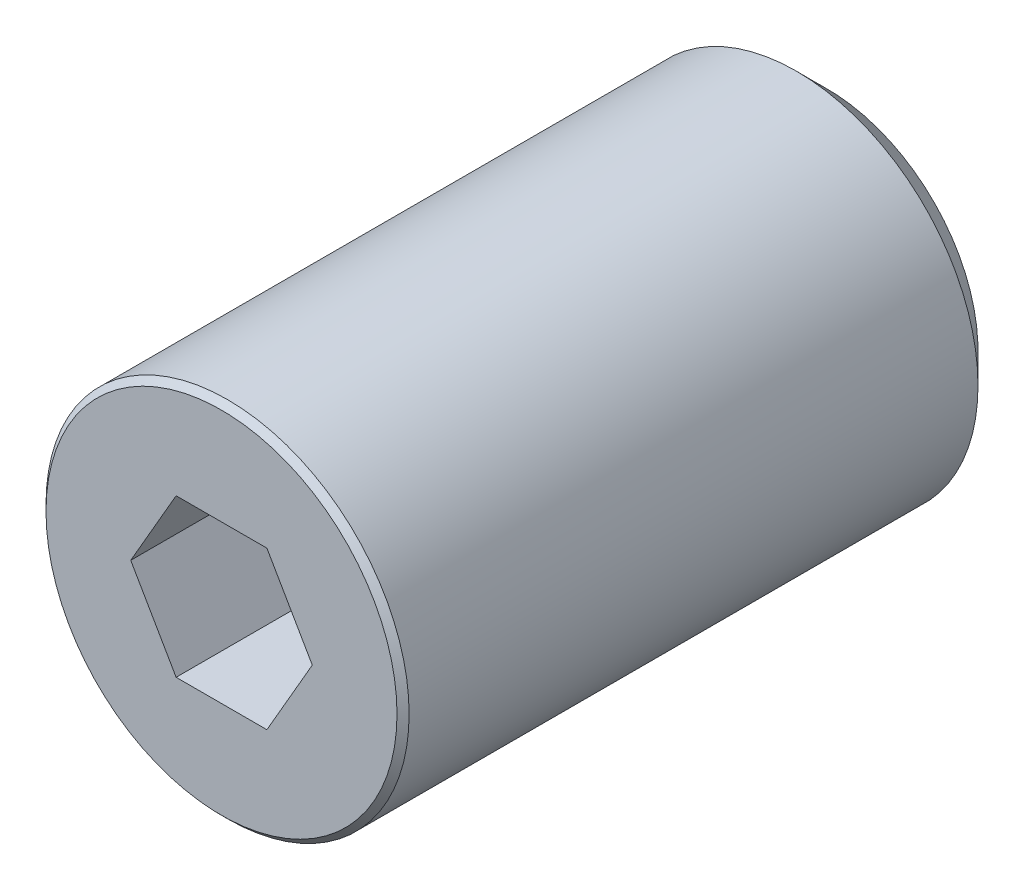
ISO-10303-21;
HEADER;
FILE_DESCRIPTION(('STEP AP214'),'2;1');
FILE_NAME('part.step','',(''),(''),'','','');
FILE_SCHEMA(('AUTOMOTIVE_DESIGN { 1 0 10303 214 1 1 1 1 }'));
ENDSEC;
DATA;
#1=APPLICATION_CONTEXT('core data for automotive mechanical design processes');
#2=APPLICATION_PROTOCOL_DEFINITION('international standard','automotive_design',2000,#1);
#3=PRODUCT_CONTEXT('',#1,'mechanical');
#4=PRODUCT('Part','Part','',(#3));
#5=PRODUCT_RELATED_PRODUCT_CATEGORY('part','',(#4));
#6=PRODUCT_DEFINITION_FORMATION('','',#4);
#7=PRODUCT_DEFINITION_CONTEXT('part definition',#1,'design');
#8=PRODUCT_DEFINITION('design','',#6,#7);
#9=PRODUCT_DEFINITION_SHAPE('','',#8);
#10=(LENGTH_UNIT() NAMED_UNIT(*) SI_UNIT(.MILLI.,.METRE.));
#11=(NAMED_UNIT(*) PLANE_ANGLE_UNIT() SI_UNIT($,.RADIAN.));
#12=(NAMED_UNIT(*) SI_UNIT($,.STERADIAN.) SOLID_ANGLE_UNIT());
#13=UNCERTAINTY_MEASURE_WITH_UNIT(LENGTH_MEASURE(1.E-05),#10,'distance_accuracy_value','');
#14=(GEOMETRIC_REPRESENTATION_CONTEXT(3) GLOBAL_UNCERTAINTY_ASSIGNED_CONTEXT((#13)) GLOBAL_UNIT_ASSIGNED_CONTEXT((#10,
#11,#12)) REPRESENTATION_CONTEXT('',''));
#15=CARTESIAN_POINT('',(0.,0.,0.));
#16=DIRECTION('',(0.,0.,1.));
#17=DIRECTION('',(1.,0.,0.));
#18=AXIS2_PLACEMENT_3D('',#15,#16,#17);
#19=CARTESIAN_POINT('',(0.,0.,0.));
#20=DIRECTION('',(0.,0.,1.));
#21=DIRECTION('',(1.,0.,0.));
#22=AXIS2_PLACEMENT_3D('',#19,#20,#21);
#23=CYLINDRICAL_SURFACE('',#22,3.);
#24=CARTESIAN_POINT('',(0.,0.,0.500000243269582));
#25=DIRECTION('',(0.,0.,-1.));
#26=DIRECTION('',(-1.,0.,0.));
#27=AXIS2_PLACEMENT_3D('',#24,#25,#26);
#28=CIRCLE('',#27,3.);
#29=CARTESIAN_POINT('',(-3.,0.,0.500000243269582));
#30=VERTEX_POINT('',#29);
#31=EDGE_CURVE('E48',#30,#30,#28,.F.);
#32=ORIENTED_EDGE('',*,*,#31,.T.);
#33=EDGE_LOOP('',(#32));
#34=FACE_BOUND('',#33,.T.);
#35=CARTESIAN_POINT('',(0.,0.,9.89999992487731));
#36=DIRECTION('',(0.,0.,1.));
#37=DIRECTION('',(1.,0.,0.));
#38=AXIS2_PLACEMENT_3D('',#35,#36,#37);
#39=CIRCLE('',#38,3.);
#40=CARTESIAN_POINT('',(3.,0.,9.89999992487731));
#41=VERTEX_POINT('',#40);
#42=EDGE_CURVE('E265',#41,#41,#39,.F.);
#43=ORIENTED_EDGE('',*,*,#42,.T.);
#44=EDGE_LOOP('',(#43));
#45=FACE_BOUND('',#44,.T.);
#46=ADVANCED_FACE('F39',(#34,#45),#23,.T.);
#47=CARTESIAN_POINT('',(3.,0.,0.));
#48=DIRECTION('',(0.,0.,-1.));
#49=DIRECTION('',(-1.,0.,0.));
#50=AXIS2_PLACEMENT_3D('',#47,#48,#49);
#51=PLANE('',#50);
#52=CARTESIAN_POINT('',(0.,0.,0.));
#53=DIRECTION('',(0.,0.,-1.));
#54=DIRECTION('',(-1.,0.,0.));
#55=AXIS2_PLACEMENT_3D('',#52,#53,#54);
#56=CIRCLE('',#55,2.4999996747622);
#57=CARTESIAN_POINT('',(-2.4999996747622,0.,0.));
#58=VERTEX_POINT('',#57);
#59=EDGE_CURVE('E11',#58,#58,#56,.T.);
#60=ORIENTED_EDGE('',*,*,#59,.T.);
#61=EDGE_LOOP('',(#60));
#62=FACE_BOUND('',#61,.T.);
#63=CARTESIAN_POINT('',(0.,0.,0.));
#64=DIRECTION('',(0.,0.,1.));
#65=DIRECTION('',(1.,0.,0.));
#66=AXIS2_PLACEMENT_3D('',#63,#64,#65);
#67=CIRCLE('',#66,1.49999899991826);
#68=CARTESIAN_POINT('',(1.49999899991826,0.,0.));
#69=VERTEX_POINT('',#68);
#70=EDGE_CURVE('E220',#69,#69,#67,.T.);
#71=ORIENTED_EDGE('',*,*,#70,.T.);
#72=EDGE_LOOP('',(#71));
#73=FACE_BOUND('',#72,.T.);
#74=ADVANCED_FACE('F131',(#62,#73),#51,.T.);
#75=CARTESIAN_POINT('',(0.,0.,10.));
#76=DIRECTION('',(0.,0.,1.));
#77=DIRECTION('',(1.,0.,0.));
#78=AXIS2_PLACEMENT_3D('',#75,#76,#77);
#79=PLANE('',#78);
#80=CARTESIAN_POINT('',(0.,0.,10.));
#81=DIRECTION('',(0.,0.,1.));
#82=DIRECTION('',(1.,0.,0.));
#83=AXIS2_PLACEMENT_3D('',#80,#81,#82);
#84=CIRCLE('',#83,2.89999987934581);
#85=CARTESIAN_POINT('',(2.89999987934581,0.,10.));
#86=VERTEX_POINT('',#85);
#87=EDGE_CURVE('E253',#86,#86,#84,.T.);
#88=ORIENTED_EDGE('',*,*,#87,.T.);
#89=EDGE_LOOP('',(#88));
#90=FACE_BOUND('',#89,.T.);
#91=DIRECTION('',(1.,0.,0.));
#92=VECTOR('',#91,1.);
#93=CARTESIAN_POINT('',(-0.749999999999874,-1.29903810567693,10.));
#94=LINE('',#93,#92);
#95=CARTESIAN_POINT('',(-0.749999999999874,-1.29903810567693,10.));
#96=VERTEX_POINT('',#95);
#97=CARTESIAN_POINT('',(0.750000000000083,-1.29903810567693,10.));
#98=VERTEX_POINT('',#97);
#99=EDGE_CURVE('E230',#96,#98,#94,.T.);
#100=ORIENTED_EDGE('',*,*,#99,.F.);
#101=DIRECTION('',(0.5,-0.866025403784439,0.));
#102=VECTOR('',#101,1.);
#103=CARTESIAN_POINT('',(-1.50000000000004,0.,10.));
#104=LINE('',#103,#102);
#105=CARTESIAN_POINT('',(-1.50000000000004,0.,10.));
#106=VERTEX_POINT('',#105);
#107=EDGE_CURVE('E247',#106,#96,#104,.T.);
#108=ORIENTED_EDGE('',*,*,#107,.F.);
#109=DIRECTION('',(-0.5,-0.866025403784439,0.));
#110=VECTOR('',#109,1.);
#111=CARTESIAN_POINT('',(-0.749999999999895,1.29903810567694,10.));
#112=LINE('',#111,#110);
#113=CARTESIAN_POINT('',(-0.749999999999895,1.29903810567694,10.));
#114=VERTEX_POINT('',#113);
#115=EDGE_CURVE('E244',#114,#106,#112,.T.);
#116=ORIENTED_EDGE('',*,*,#115,.F.);
#117=DIRECTION('',(-1.,0.,0.));
#118=VECTOR('',#117,1.);
#119=CARTESIAN_POINT('',(0.750000000000062,1.29903810567694,10.));
#120=LINE('',#119,#118);
#121=CARTESIAN_POINT('',(0.750000000000062,1.29903810567694,10.));
#122=VERTEX_POINT('',#121);
#123=EDGE_CURVE('E241',#122,#114,#120,.T.);
#124=ORIENTED_EDGE('',*,*,#123,.F.);
#125=DIRECTION('',(-0.5,0.866025403784439,0.));
#126=VECTOR('',#125,1.);
#127=CARTESIAN_POINT('',(1.50000000000023,0.,10.));
#128=LINE('',#127,#126);
#129=CARTESIAN_POINT('',(1.50000000000023,0.,10.));
#130=VERTEX_POINT('',#129);
#131=EDGE_CURVE('E238',#130,#122,#128,.T.);
#132=ORIENTED_EDGE('',*,*,#131,.F.);
#133=DIRECTION('',(0.5,0.866025403784439,0.));
#134=VECTOR('',#133,1.);
#135=CARTESIAN_POINT('',(0.750000000000083,-1.29903810567693,10.));
#136=LINE('',#135,#134);
#137=EDGE_CURVE('E233',#98,#130,#136,.T.);
#138=ORIENTED_EDGE('',*,*,#137,.F.);
#139=EDGE_LOOP('',(#100,#108,#116,#124,#132,#138));
#140=FACE_BOUND('',#139,.T.);
#141=ADVANCED_FACE('F137',(#90,#140),#79,.T.);
#142=CARTESIAN_POINT('',(-0.749999999999874,-1.29903810567693,7.));
#143=DIRECTION('',(0.,-1.,0.));
#144=DIRECTION('',(0.,0.,-1.));
#145=AXIS2_PLACEMENT_3D('',#142,#143,#144);
#146=PLANE('',#145);
#147=DIRECTION('',(0.,0.,1.));
#148=VECTOR('',#147,1.);
#149=CARTESIAN_POINT('',(0.750000000000083,-1.29903810567693,7.));
#150=LINE('',#149,#148);
#151=CARTESIAN_POINT('',(0.750000000000083,-1.29903810567693,8.00000000000002));
#152=VERTEX_POINT('',#151);
#153=EDGE_CURVE('E250',#152,#98,#150,.T.);
#154=ORIENTED_EDGE('',*,*,#153,.F.);
#155=DIRECTION('',(-1.,0.,0.));
#156=VECTOR('',#155,1.);
#157=CARTESIAN_POINT('',(-0.749999999999874,-1.29903810567693,8.00000000000002));
#158=LINE('',#157,#156);
#159=CARTESIAN_POINT('',(-0.749999999999874,-1.29903810567693,8.00000000000002));
#160=VERTEX_POINT('',#159);
#161=EDGE_CURVE('E209',#152,#160,#158,.T.);
#162=ORIENTED_EDGE('',*,*,#161,.T.);
#163=DIRECTION('',(0.,0.,1.));
#164=VECTOR('',#163,1.);
#165=CARTESIAN_POINT('',(-0.749999999999874,-1.29903810567693,7.));
#166=LINE('',#165,#164);
#167=EDGE_CURVE('E251',#160,#96,#166,.T.);
#168=ORIENTED_EDGE('',*,*,#167,.T.);
#169=ORIENTED_EDGE('',*,*,#99,.T.);
#170=EDGE_LOOP('',(#154,#162,#168,#169));
#171=FACE_BOUND('',#170,.T.);
#172=ADVANCED_FACE('F286',(#171),#146,.F.);
#173=CARTESIAN_POINT('',(-1.50000000000004,0.,7.));
#174=DIRECTION('',(-0.866025403784439,-0.5,0.));
#175=DIRECTION('',(0.5,-0.866025403784439,0.));
#176=AXIS2_PLACEMENT_3D('',#173,#174,#175);
#177=PLANE('',#176);
#178=ORIENTED_EDGE('',*,*,#167,.F.);
#179=DIRECTION('',(-0.5,0.866025403784439,0.));
#180=VECTOR('',#179,1.);
#181=CARTESIAN_POINT('',(-1.50000000000004,0.,8.00000000000002));
#182=LINE('',#181,#180);
#183=CARTESIAN_POINT('',(-1.50000000000004,0.,8.00000000000002));
#184=VERTEX_POINT('',#183);
#185=EDGE_CURVE('E280',#160,#184,#182,.T.);
#186=ORIENTED_EDGE('',*,*,#185,.T.);
#187=DIRECTION('',(0.,0.,1.));
#188=VECTOR('',#187,1.);
#189=CARTESIAN_POINT('',(-1.50000000000004,0.,7.));
#190=LINE('',#189,#188);
#191=EDGE_CURVE('E254',#184,#106,#190,.T.);
#192=ORIENTED_EDGE('',*,*,#191,.T.);
#193=ORIENTED_EDGE('',*,*,#107,.T.);
#194=EDGE_LOOP('',(#178,#186,#192,#193));
#195=FACE_BOUND('',#194,.T.);
#196=ADVANCED_FACE('F290',(#195),#177,.F.);
#197=CARTESIAN_POINT('',(-0.749999999999895,1.29903810567694,7.));
#198=DIRECTION('',(-0.866025403784439,0.5,0.));
#199=DIRECTION('',(-0.5,-0.866025403784439,0.));
#200=AXIS2_PLACEMENT_3D('',#197,#198,#199);
#201=PLANE('',#200);
#202=ORIENTED_EDGE('',*,*,#191,.F.);
#203=DIRECTION('',(0.5,0.866025403784439,0.));
#204=VECTOR('',#203,1.);
#205=CARTESIAN_POINT('',(-0.749999999999895,1.29903810567694,8.00000000000002));
#206=LINE('',#205,#204);
#207=CARTESIAN_POINT('',(-0.749999999999895,1.29903810567694,8.00000000000002));
#208=VERTEX_POINT('',#207);
#209=EDGE_CURVE('E283',#184,#208,#206,.T.);
#210=ORIENTED_EDGE('',*,*,#209,.T.);
#211=DIRECTION('',(0.,0.,1.));
#212=VECTOR('',#211,1.);
#213=CARTESIAN_POINT('',(-0.749999999999895,1.29903810567694,7.));
#214=LINE('',#213,#212);
#215=EDGE_CURVE('E256',#208,#114,#214,.T.);
#216=ORIENTED_EDGE('',*,*,#215,.T.);
#217=ORIENTED_EDGE('',*,*,#115,.T.);
#218=EDGE_LOOP('',(#202,#210,#216,#217));
#219=FACE_BOUND('',#218,.T.);
#220=ADVANCED_FACE('F302',(#219),#201,.F.);
#221=CARTESIAN_POINT('',(0.750000000000062,1.29903810567694,7.));
#222=DIRECTION('',(0.,1.,0.));
#223=DIRECTION('',(0.,0.,1.));
#224=AXIS2_PLACEMENT_3D('',#221,#222,#223);
#225=PLANE('',#224);
#226=ORIENTED_EDGE('',*,*,#215,.F.);
#227=DIRECTION('',(1.,0.,0.));
#228=VECTOR('',#227,1.);
#229=CARTESIAN_POINT('',(0.750000000000062,1.29903810567694,8.00000000000002));
#230=LINE('',#229,#228);
#231=CARTESIAN_POINT('',(0.750000000000062,1.29903810567694,8.00000000000002));
#232=VERTEX_POINT('',#231);
#233=EDGE_CURVE('E63',#208,#232,#230,.T.);
#234=ORIENTED_EDGE('',*,*,#233,.T.);
#235=DIRECTION('',(0.,0.,1.));
#236=VECTOR('',#235,1.);
#237=CARTESIAN_POINT('',(0.750000000000062,1.29903810567694,7.));
#238=LINE('',#237,#236);
#239=EDGE_CURVE('E258',#232,#122,#238,.T.);
#240=ORIENTED_EDGE('',*,*,#239,.T.);
#241=ORIENTED_EDGE('',*,*,#123,.T.);
#242=EDGE_LOOP('',(#226,#234,#240,#241));
#243=FACE_BOUND('',#242,.T.);
#244=ADVANCED_FACE('F303',(#243),#225,.F.);
#245=CARTESIAN_POINT('',(1.50000000000023,0.,7.));
#246=DIRECTION('',(0.866025403784439,0.5,0.));
#247=DIRECTION('',(-0.5,0.866025403784439,0.));
#248=AXIS2_PLACEMENT_3D('',#245,#246,#247);
#249=PLANE('',#248);
#250=ORIENTED_EDGE('',*,*,#239,.F.);
#251=DIRECTION('',(0.5,-0.866025403784439,0.));
#252=VECTOR('',#251,1.);
#253=CARTESIAN_POINT('',(1.50000000000023,0.,8.00000000000002));
#254=LINE('',#253,#252);
#255=CARTESIAN_POINT('',(1.50000000000023,0.,8.00000000000002));
#256=VERTEX_POINT('',#255);
#257=EDGE_CURVE('E55',#232,#256,#254,.T.);
#258=ORIENTED_EDGE('',*,*,#257,.T.);
#259=DIRECTION('',(0.,0.,1.));
#260=VECTOR('',#259,1.);
#261=CARTESIAN_POINT('',(1.50000000000023,0.,7.));
#262=LINE('',#261,#260);
#263=EDGE_CURVE('E260',#256,#130,#262,.T.);
#264=ORIENTED_EDGE('',*,*,#263,.T.);
#265=ORIENTED_EDGE('',*,*,#131,.T.);
#266=EDGE_LOOP('',(#250,#258,#264,#265));
#267=FACE_BOUND('',#266,.T.);
#268=ADVANCED_FACE('F309',(#267),#249,.F.);
#269=CARTESIAN_POINT('',(0.750000000000083,-1.29903810567693,7.));
#270=DIRECTION('',(0.866025403784439,-0.5,0.));
#271=DIRECTION('',(0.5,0.866025403784439,0.));
#272=AXIS2_PLACEMENT_3D('',#269,#270,#271);
#273=PLANE('',#272);
#274=ORIENTED_EDGE('',*,*,#263,.F.);
#275=DIRECTION('',(-0.5,-0.866025403784439,0.));
#276=VECTOR('',#275,1.);
#277=CARTESIAN_POINT('',(0.750000000000083,-1.29903810567693,8.00000000000002));
#278=LINE('',#277,#276);
#279=EDGE_CURVE('E201',#256,#152,#278,.T.);
#280=ORIENTED_EDGE('',*,*,#279,.T.);
#281=ORIENTED_EDGE('',*,*,#153,.T.);
#282=ORIENTED_EDGE('',*,*,#137,.T.);
#283=EDGE_LOOP('',(#274,#280,#281,#282));
#284=FACE_BOUND('',#283,.T.);
#285=ADVANCED_FACE('F126',(#284),#273,.F.);
#286=CARTESIAN_POINT('',(0.,0.,7.));
#287=DIRECTION('',(0.,0.,1.));
#288=DIRECTION('',(1.,0.,0.));
#289=AXIS2_PLACEMENT_3D('',#286,#287,#288);
#290=PLANE('',#289);
#291=DIRECTION('',(-0.5,-0.866025403784439,0.));
#292=VECTOR('',#291,1.);
#293=CARTESIAN_POINT('',(-0.150000000000072,0.0866025403784857,7.));
#294=LINE('',#293,#292);
#295=CARTESIAN_POINT('',(-0.0999999999999144,0.173205080757203,7.));
#296=VERTEX_POINT('',#295);
#297=CARTESIAN_POINT('',(-0.200000000000082,0.,7.));
#298=VERTEX_POINT('',#297);
#299=EDGE_CURVE('E275',#296,#298,#294,.T.);
#300=ORIENTED_EDGE('',*,*,#299,.T.);
#301=DIRECTION('',(0.5,-0.866025403784439,0.));
#302=VECTOR('',#301,1.);
#303=CARTESIAN_POINT('',(-0.150000000000051,-0.0866025403784735,7.));
#304=LINE('',#303,#302);
#305=CARTESIAN_POINT('',(-0.0999999999998934,-0.173205080757191,7.));
#306=VERTEX_POINT('',#305);
#307=EDGE_CURVE('E277',#298,#306,#304,.T.);
#308=ORIENTED_EDGE('',*,*,#307,.T.);
#309=DIRECTION('',(1.,0.,0.));
#310=VECTOR('',#309,1.);
#311=CARTESIAN_POINT('',(0.,-0.173205080757191,7.));
#312=LINE('',#311,#310);
#313=CARTESIAN_POINT('',(0.100000000000102,-0.173205080757191,7.));
#314=VERTEX_POINT('',#313);
#315=EDGE_CURVE('E273',#306,#314,#312,.T.);
#316=ORIENTED_EDGE('',*,*,#315,.T.);
#317=DIRECTION('',(0.5,0.866025403784439,0.));
#318=VECTOR('',#317,1.);
#319=CARTESIAN_POINT('',(0.150000000000208,-0.0866025403785638,7.));
#320=LINE('',#319,#318);
#321=CARTESIAN_POINT('',(0.20000000000027,0.,7.));
#322=VERTEX_POINT('',#321);
#323=EDGE_CURVE('E269',#314,#322,#320,.T.);
#324=ORIENTED_EDGE('',*,*,#323,.T.);
#325=DIRECTION('',(-0.5,0.866025403784439,0.));
#326=VECTOR('',#325,1.);
#327=CARTESIAN_POINT('',(0.150000000000197,0.0866025403785578,7.));
#328=LINE('',#327,#326);
#329=CARTESIAN_POINT('',(0.100000000000081,0.173205080757203,7.));
#330=VERTEX_POINT('',#329);
#331=EDGE_CURVE('E195',#322,#330,#328,.T.);
#332=ORIENTED_EDGE('',*,*,#331,.T.);
#333=DIRECTION('',(-1.,0.,0.));
#334=VECTOR('',#333,1.);
#335=CARTESIAN_POINT('',(0.,0.173205080757203,7.));
#336=LINE('',#335,#334);
#337=EDGE_CURVE('E271',#330,#296,#336,.T.);
#338=ORIENTED_EDGE('',*,*,#337,.T.);
#339=EDGE_LOOP('',(#300,#308,#316,#324,#332,#338));
#340=FACE_BOUND('',#339,.T.);
#341=ADVANCED_FACE('F116',(#340),#290,.T.);
#342=CARTESIAN_POINT('',(0.,0.,0.500000311660642));
#343=DIRECTION('',(0.,0.,-1.));
#344=DIRECTION('',(-1.,0.,0.));
#345=AXIS2_PLACEMENT_3D('',#342,#343,#344);
#346=CONICAL_SURFACE('',#345,0.,1.24904538538531);
#347=ORIENTED_EDGE('',*,*,#70,.F.);
#348=EDGE_LOOP('',(#347));
#349=FACE_BOUND('',#348,.T.);
#350=CARTESIAN_POINT('',(0.,0.,0.500000311660642));
#351=VERTEX_POINT('',#350);
#352=VERTEX_LOOP('',#351);
#353=FACE_BOUND('',#352,.T.);
#354=ADVANCED_FACE('F113',(#349,#353),#346,.F.);
#355=CARTESIAN_POINT('',(0.,0.,10.));
#356=DIRECTION('',(0.,0.,-1.));
#357=DIRECTION('',(-1.,0.,0.));
#358=AXIS2_PLACEMENT_3D('',#355,#356,#357);
#359=CONICAL_SURFACE('',#358,2.89999987934581,0.785398391054734);
#360=ORIENTED_EDGE('',*,*,#42,.F.);
#361=EDGE_LOOP('',(#360));
#362=FACE_BOUND('',#361,.T.);
#363=ORIENTED_EDGE('',*,*,#87,.F.);
#364=EDGE_LOOP('',(#363));
#365=FACE_BOUND('',#364,.T.);
#366=ADVANCED_FACE('F115',(#362,#365),#359,.T.);
#367=CARTESIAN_POINT('',(0.150000000000197,0.0866025403785578,7.));
#368=DIRECTION('',(0.575118031124382,0.332044550085469,-0.747653440461658));
#369=DIRECTION('',(-0.5,0.866025403784439,0.));
#370=AXIS2_PLACEMENT_3D('',#367,#368,#369);
#371=PLANE('',#370);
#372=DIRECTION('',(0.792623989104585,0.,0.609710760849712));
#373=VECTOR('',#372,1.);
#374=CARTESIAN_POINT('',(0.168587360595028,0.,6.97583643122674));
#375=LINE('',#374,#373);
#376=EDGE_CURVE('E191',#256,#322,#375,.F.);
#377=ORIENTED_EDGE('',*,*,#376,.F.);
#378=ORIENTED_EDGE('',*,*,#257,.F.);
#379=DIRECTION('',(-0.396311994552292,-0.686432510213531,-0.609710760849712));
#380=VECTOR('',#379,1.);
#381=CARTESIAN_POINT('',(0.0842936802974667,0.146000937032355,6.97583643122675));
#382=LINE('',#381,#380);
#383=EDGE_CURVE('E197',#330,#232,#382,.F.);
#384=ORIENTED_EDGE('',*,*,#383,.F.);
#385=ORIENTED_EDGE('',*,*,#331,.F.);
#386=EDGE_LOOP('',(#377,#378,#384,#385));
#387=FACE_BOUND('',#386,.T.);
#388=ADVANCED_FACE('F123',(#387),#371,.F.);
#389=CARTESIAN_POINT('',(0.,0.173205080757203,7.));
#390=DIRECTION('',(0.,0.664089100170938,-0.747653440461658));
#391=DIRECTION('',(-1.,0.,0.));
#392=AXIS2_PLACEMENT_3D('',#389,#390,#391);
#393=PLANE('',#392);
#394=ORIENTED_EDGE('',*,*,#383,.T.);
#395=ORIENTED_EDGE('',*,*,#233,.F.);
#396=DIRECTION('',(0.396311994552293,-0.686432510213531,-0.609710760849712));
#397=VECTOR('',#396,1.);
#398=CARTESIAN_POINT('',(-0.0842936802972632,0.146000937032291,6.97583643122669));
#399=LINE('',#398,#397);
#400=EDGE_CURVE('E198',#296,#208,#399,.F.);
#401=ORIENTED_EDGE('',*,*,#400,.F.);
#402=ORIENTED_EDGE('',*,*,#337,.F.);
#403=EDGE_LOOP('',(#394,#395,#401,#402));
#404=FACE_BOUND('',#403,.T.);
#405=ADVANCED_FACE('F176',(#404),#393,.F.);
#406=CARTESIAN_POINT('',(0.150000000000208,-0.0866025403785638,7.));
#407=DIRECTION('',(0.575118031124381,-0.332044550085469,-0.747653440461658));
#408=DIRECTION('',(0.5,0.866025403784439,0.));
#409=AXIS2_PLACEMENT_3D('',#406,#407,#408);
#410=PLANE('',#409);
#411=ORIENTED_EDGE('',*,*,#376,.T.);
#412=ORIENTED_EDGE('',*,*,#323,.F.);
#413=DIRECTION('',(0.396311994552293,-0.686432510213531,0.609710760849712));
#414=VECTOR('',#413,1.);
#415=CARTESIAN_POINT('',(0.0842936802974844,-0.146000937032337,6.97583643122674));
#416=LINE('',#415,#414);
#417=EDGE_CURVE('E203',#152,#314,#416,.F.);
#418=ORIENTED_EDGE('',*,*,#417,.F.);
#419=ORIENTED_EDGE('',*,*,#279,.F.);
#420=EDGE_LOOP('',(#411,#412,#418,#419));
#421=FACE_BOUND('',#420,.T.);
#422=ADVANCED_FACE('F169',(#421),#410,.F.);
#423=CARTESIAN_POINT('',(-0.150000000000072,0.0866025403784856,7.));
#424=DIRECTION('',(-0.575118031124381,0.332044550085469,-0.747653440461658));
#425=DIRECTION('',(-0.5,-0.866025403784439,0.));
#426=AXIS2_PLACEMENT_3D('',#423,#424,#425);
#427=PLANE('',#426);
#428=ORIENTED_EDGE('',*,*,#400,.T.);
#429=ORIENTED_EDGE('',*,*,#209,.F.);
#430=DIRECTION('',(0.792623989104585,0.,-0.609710760849712));
#431=VECTOR('',#430,1.);
#432=CARTESIAN_POINT('',(-0.168587360594859,0.,6.97583643122675));
#433=LINE('',#432,#431);
#434=EDGE_CURVE('E215',#298,#184,#433,.F.);
#435=ORIENTED_EDGE('',*,*,#434,.F.);
#436=ORIENTED_EDGE('',*,*,#299,.F.);
#437=EDGE_LOOP('',(#428,#429,#435,#436));
#438=FACE_BOUND('',#437,.T.);
#439=ADVANCED_FACE('F162',(#438),#427,.F.);
#440=CARTESIAN_POINT('',(0.,-0.173205080757191,7.));
#441=DIRECTION('',(0.,-0.664089100170938,-0.747653440461658));
#442=DIRECTION('',(1.,0.,0.));
#443=AXIS2_PLACEMENT_3D('',#440,#441,#442);
#444=PLANE('',#443);
#445=ORIENTED_EDGE('',*,*,#417,.T.);
#446=ORIENTED_EDGE('',*,*,#315,.F.);
#447=DIRECTION('',(-0.396311994552292,-0.686432510213531,0.609710760849712));
#448=VECTOR('',#447,1.);
#449=CARTESIAN_POINT('',(-0.0842936802972421,-0.146000937032279,6.97583643122669));
#450=LINE('',#449,#448);
#451=EDGE_CURVE('E213',#160,#306,#450,.F.);
#452=ORIENTED_EDGE('',*,*,#451,.F.);
#453=ORIENTED_EDGE('',*,*,#161,.F.);
#454=EDGE_LOOP('',(#445,#446,#452,#453));
#455=FACE_BOUND('',#454,.T.);
#456=ADVANCED_FACE('F155',(#455),#444,.F.);
#457=CARTESIAN_POINT('',(-0.150000000000051,-0.0866025403784734,7.));
#458=DIRECTION('',(-0.575118031124381,-0.332044550085469,-0.747653440461658));
#459=DIRECTION('',(0.5,-0.866025403784439,0.));
#460=AXIS2_PLACEMENT_3D('',#457,#458,#459);
#461=PLANE('',#460);
#462=ORIENTED_EDGE('',*,*,#434,.T.);
#463=ORIENTED_EDGE('',*,*,#185,.F.);
#464=ORIENTED_EDGE('',*,*,#451,.T.);
#465=ORIENTED_EDGE('',*,*,#307,.F.);
#466=EDGE_LOOP('',(#462,#463,#464,#465));
#467=FACE_BOUND('',#466,.T.);
#468=ADVANCED_FACE('F149',(#467),#461,.F.);
#469=CARTESIAN_POINT('',(0.,0.,0.500000243269582));
#470=DIRECTION('',(0.,0.,1.));
#471=DIRECTION('',(1.,0.,0.));
#472=AXIS2_PLACEMENT_3D('',#469,#470,#471);
#473=CONICAL_SURFACE('',#472,3.,0.785398245365615);
#474=ORIENTED_EDGE('',*,*,#59,.F.);
#475=EDGE_LOOP('',(#474));
#476=FACE_BOUND('',#475,.T.);
#477=ORIENTED_EDGE('',*,*,#31,.F.);
#478=EDGE_LOOP('',(#477));
#479=FACE_BOUND('',#478,.T.);
#480=ADVANCED_FACE('F42',(#476,#479),#473,.T.);
#481=CLOSED_SHELL('',(#46,#74,#141,#172,#196,#220,#244,#268,#285,#341,#354,#366,#388,#405,#422,
#439,#456,#468,#480));
#482=MANIFOLD_SOLID_BREP('B2',#481);
#483=ADVANCED_BREP_SHAPE_REPRESENTATION('',(#18,#482),#14);
#484=SHAPE_DEFINITION_REPRESENTATION(#9,#483);
ENDSEC;
END-ISO-10303-21;
